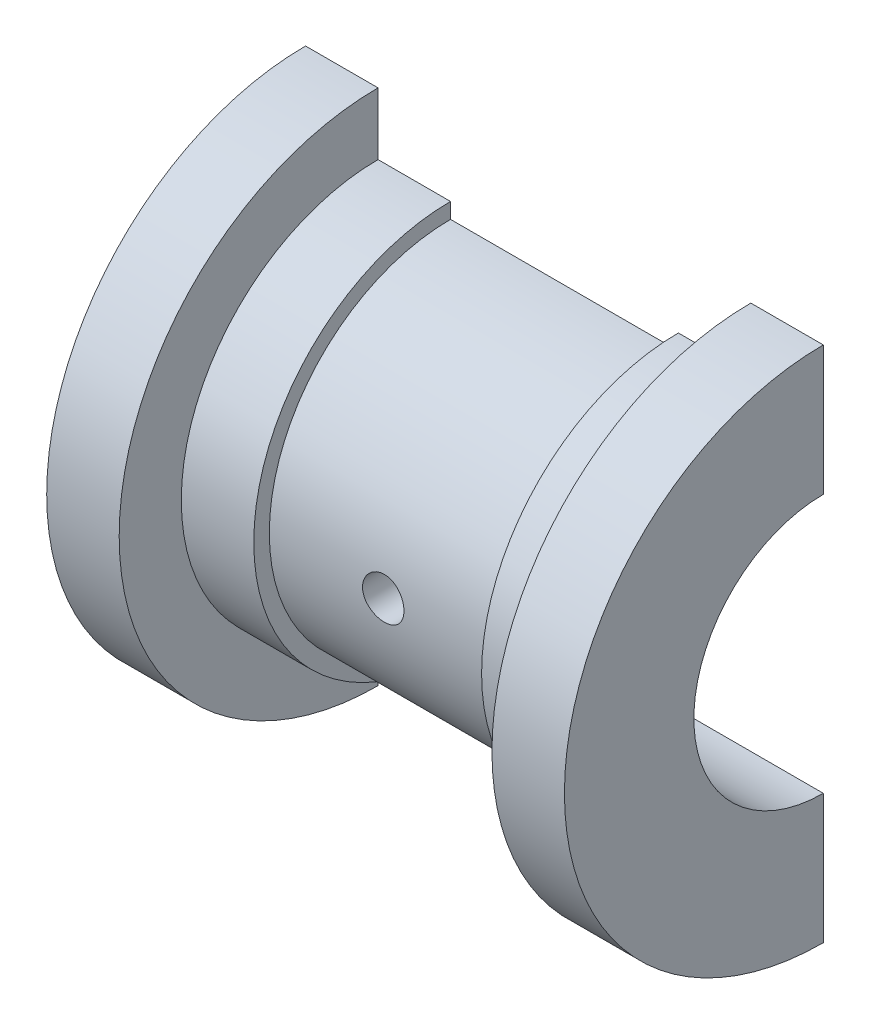
ISO-10303-21;
HEADER;
FILE_DESCRIPTION(('STEP AP214'),'2;1');
FILE_NAME('part.step','',(''),(''),'','','');
FILE_SCHEMA(('AUTOMOTIVE_DESIGN { 1 0 10303 214 1 1 1 1 }'));
ENDSEC;
DATA;
#1=APPLICATION_CONTEXT('core data for automotive mechanical design processes');
#2=APPLICATION_PROTOCOL_DEFINITION('international standard','automotive_design',2000,#1);
#3=PRODUCT_CONTEXT('',#1,'mechanical');
#4=PRODUCT('Part','Part','',(#3));
#5=PRODUCT_RELATED_PRODUCT_CATEGORY('part','',(#4));
#6=PRODUCT_DEFINITION_FORMATION('','',#4);
#7=PRODUCT_DEFINITION_CONTEXT('part definition',#1,'design');
#8=PRODUCT_DEFINITION('design','',#6,#7);
#9=PRODUCT_DEFINITION_SHAPE('','',#8);
#10=(LENGTH_UNIT() NAMED_UNIT(*) SI_UNIT(.MILLI.,.METRE.));
#11=(NAMED_UNIT(*) PLANE_ANGLE_UNIT() SI_UNIT($,.RADIAN.));
#12=(NAMED_UNIT(*) SI_UNIT($,.STERADIAN.) SOLID_ANGLE_UNIT());
#13=UNCERTAINTY_MEASURE_WITH_UNIT(LENGTH_MEASURE(1.E-05),#10,'distance_accuracy_value','');
#14=(GEOMETRIC_REPRESENTATION_CONTEXT(3) GLOBAL_UNCERTAINTY_ASSIGNED_CONTEXT((#13)) GLOBAL_UNIT_ASSIGNED_CONTEXT((#10,
#11,#12)) REPRESENTATION_CONTEXT('',''));
#15=CARTESIAN_POINT('',(0.,0.,0.));
#16=DIRECTION('',(0.,0.,1.));
#17=DIRECTION('',(1.,0.,0.));
#18=AXIS2_PLACEMENT_3D('',#15,#16,#17);
#19=CARTESIAN_POINT('',(-38.9493607052265,0.,0.));
#20=DIRECTION('',(-1.,0.,0.));
#21=DIRECTION('',(0.,-1.,0.));
#22=AXIS2_PLACEMENT_3D('',#19,#20,#21);
#23=CYLINDRICAL_SURFACE('',#22,17.5);
#24=CARTESIAN_POINT('',(11.,0.,0.));
#25=DIRECTION('',(-1.,0.,0.));
#26=DIRECTION('',(0.,-1.,0.));
#27=AXIS2_PLACEMENT_3D('',#24,#25,#26);
#28=CIRCLE('',#27,17.5);
#29=CARTESIAN_POINT('',(11.,-17.5,-1.2220184685951E-13));
#30=VERTEX_POINT('',#29);
#31=CARTESIAN_POINT('',(11.,17.5,0.));
#32=VERTEX_POINT('',#31);
#33=EDGE_CURVE('E192',#30,#32,#28,.T.);
#34=ORIENTED_EDGE('',*,*,#33,.T.);
#35=DIRECTION('',(-1.,0.,0.));
#36=VECTOR('',#35,1.);
#37=CARTESIAN_POINT('',(-11.,17.5,0.));
#38=LINE('',#37,#36);
#39=CARTESIAN_POINT('',(-11.,17.5,0.));
#40=VERTEX_POINT('',#39);
#41=EDGE_CURVE('E218',#32,#40,#38,.T.);
#42=ORIENTED_EDGE('',*,*,#41,.T.);
#43=CARTESIAN_POINT('',(-11.,0.,0.));
#44=DIRECTION('',(-1.,0.,0.));
#45=DIRECTION('',(0.,-1.,0.));
#46=AXIS2_PLACEMENT_3D('',#43,#44,#45);
#47=CIRCLE('',#46,17.5);
#48=CARTESIAN_POINT('',(-11.,-17.5,-1.2220184685951E-13));
#49=VERTEX_POINT('',#48);
#50=EDGE_CURVE('E194',#49,#40,#47,.T.);
#51=ORIENTED_EDGE('',*,*,#50,.F.);
#52=DIRECTION('',(-1.,0.,0.));
#53=VECTOR('',#52,1.);
#54=CARTESIAN_POINT('',(-11.,-17.5,-1.2220184685951E-13));
#55=LINE('',#54,#53);
#56=EDGE_CURVE('E170',#30,#49,#55,.T.);
#57=ORIENTED_EDGE('',*,*,#56,.F.);
#58=EDGE_LOOP('',(#34,#42,#51,#57));
#59=FACE_BOUND('',#58,.T.);
#60=CARTESIAN_POINT('',(0.,-2.00000000000012,17.3853386507137));
#61=CARTESIAN_POINT('',(0.111946589372524,-1.99999519733607,17.3853401353315));
#62=CARTESIAN_POINT('',(0.223964994921923,-1.99056928251654,17.3864315751054));
#63=CARTESIAN_POINT('',(0.444889671697474,-1.95311344773108,17.3906782331753));
#64=CARTESIAN_POINT('',(0.553792479503965,-1.92506360351956,17.3938356616542));
#65=CARTESIAN_POINT('',(0.765255030279527,-1.85119296589638,17.4018520931882));
#66=CARTESIAN_POINT('',(0.867818819285595,-1.80538364660721,17.4067099973959));
#67=CARTESIAN_POINT('',(1.06378206604588,-1.69731788496022,17.4175786814491));
#68=CARTESIAN_POINT('',(1.15718320126785,-1.63506446086883,17.423589249671));
#69=CARTESIAN_POINT('',(1.33262956371172,-1.49556368835398,17.4361176819346));
#70=CARTESIAN_POINT('',(1.41462552791579,-1.41825455823821,17.4426375676046));
#71=CARTESIAN_POINT('',(1.56450902249383,-1.2509695482429,17.4554317583341));
#72=CARTESIAN_POINT('',(1.63239587710581,-1.16099306200083,17.4617060516192));
#73=CARTESIAN_POINT('',(1.75230824059131,-0.970620910263756,17.4733225280882));
#74=CARTESIAN_POINT('',(1.80428955803743,-0.870197236204839,17.4786620969871));
#75=CARTESIAN_POINT('',(1.89063240605875,-0.661974973210041,17.4877853680334));
#76=CARTESIAN_POINT('',(1.9249944880326,-0.554176615186537,17.4915691188697));
#77=CARTESIAN_POINT('',(1.97497734252851,-0.334766558288145,17.4971402074225));
#78=CARTESIAN_POINT('',(1.99067964857446,-0.22317365719472,17.4989362281041));
#79=CARTESIAN_POINT('',(2.00314972142082,0.00107691382543691,17.5003590938998));
#80=CARTESIAN_POINT('',(1.99991811760643,0.113734548234908,17.4999860111176));
#81=CARTESIAN_POINT('',(1.9746778272773,0.336362487849558,17.497119767547));
#82=CARTESIAN_POINT('',(1.95275682041612,0.446342879003147,17.4946365066491));
#83=CARTESIAN_POINT('',(1.89089682950376,0.661053445479663,17.487840154992));
#84=CARTESIAN_POINT('',(1.85095755129325,0.765783535057179,17.4835270343592));
#85=CARTESIAN_POINT('',(1.75410019097594,0.967294288035632,17.4735386514763));
#86=CARTESIAN_POINT('',(1.69714377600709,1.06405636819033,17.4678603196472));
#87=CARTESIAN_POINT('',(1.56789678444337,1.2466816391767,17.4557776619181));
#88=CARTESIAN_POINT('',(1.49560561983236,1.33254441186891,17.449373308183));
#89=CARTESIAN_POINT('',(1.33724919448781,1.49144815236592,17.436513040988));
#90=CARTESIAN_POINT('',(1.25110758210007,1.56441304576833,17.4300570420279));
#91=CARTESIAN_POINT('',(1.0677588923309,1.69485961446726,17.4178574111694));
#92=CARTESIAN_POINT('',(0.970551789715113,1.7523412544539,17.4121137808956));
#93=CARTESIAN_POINT('',(0.767767939743451,1.85019181534937,17.4019890438088));
#94=CARTESIAN_POINT('',(0.662188535919723,1.89055527879392,17.3976083716403));
#95=CARTESIAN_POINT('',(0.445689423466888,1.95295957446176,17.3907142897617));
#96=CARTESIAN_POINT('',(0.334769928945009,1.97500114064263,17.3882008052542));
#97=CARTESIAN_POINT('',(0.111409276007052,2.00003653434772,17.3853390699854));
#98=CARTESIAN_POINT('',(-0.00101976549901365,2.00313713351242,17.384978682311));
#99=CARTESIAN_POINT('',(-0.224795725911944,1.99048370024856,17.3864318824203));
#100=CARTESIAN_POINT('',(-0.336142663982754,1.97473000234344,17.3882454316329));
#101=CARTESIAN_POINT('',(-0.554277710431836,1.92490480743112,17.3938311078367));
#102=CARTESIAN_POINT('',(-0.661077653557209,1.89088445720899,17.3975977651037));
#103=CARTESIAN_POINT('',(-0.867456208856069,1.80554412069028,17.4066608217964));
#104=CARTESIAN_POINT('',(-0.96703460698983,1.75422362188817,17.4119572665405));
#105=CARTESIAN_POINT('',(-1.15662812006314,1.63547501760183,17.4235123453982));
#106=CARTESIAN_POINT('',(-1.24659891285623,1.56797655870478,17.4297751382952));
#107=CARTESIAN_POINT('',(-1.41397230825862,1.41888814821172,17.442543959092));
#108=CARTESIAN_POINT('',(-1.49137450327603,1.33729773979944,17.4490499948718));
#109=CARTESIAN_POINT('',(-1.63178548317454,1.16187651855529,17.4616092377758));
#110=CARTESIAN_POINT('',(-1.69472433770165,1.0679895447053,17.4676601534551));
#111=CARTESIAN_POINT('',(-1.80393937919364,0.870915351390238,17.4785935486018));
#112=CARTESIAN_POINT('',(-1.8502158540187,0.767728292632447,17.4834760482544));
#113=CARTESIAN_POINT('',(-1.92467566123987,0.555220730050587,17.4915122431867));
#114=CARTESIAN_POINT('',(-1.95290023506191,0.445914831710572,17.4946698766728));
#115=CARTESIAN_POINT('',(-1.99058941951927,0.224077216219246,17.498916830849));
#116=CARTESIAN_POINT('',(-2.00005473054384,0.111545619660616,17.5000062287579));
#117=CARTESIAN_POINT('',(-1.99994510250234,-0.112864401253256,17.4999937520126));
#118=CARTESIAN_POINT('',(-1.99047832045056,-0.224742894695173,17.4989043247502));
#119=CARTESIAN_POINT('',(-1.95300127134245,-0.445308378800977,17.4946812487719));
#120=CARTESIAN_POINT('',(-1.92499100344009,-0.553995369319257,17.4915475999627));
#121=CARTESIAN_POINT('',(-1.85125428527817,-0.765084431079367,17.4835868311737));
#122=CARTESIAN_POINT('',(-1.80553211653411,-0.867488014290848,17.478760120486));
#123=CARTESIAN_POINT('',(-1.69768073352085,-1.06318537269573,17.4679493137143));
#124=CARTESIAN_POINT('',(-1.63555145524283,-1.15647911234707,17.4619652131149));
#125=CARTESIAN_POINT('',(-1.49624648821104,-1.33186210611065,17.4494678477128));
#126=CARTESIAN_POINT('',(-1.41899021819487,-1.41388716420701,17.4429518630307));
#127=CARTESIAN_POINT('',(-1.25178901681435,-1.56385330094132,17.4301475365176));
#128=CARTESIAN_POINT('',(-1.16184106815131,-1.63179102096634,17.4238592492668));
#129=CARTESIAN_POINT('',(-0.971480376349263,-1.75183717616211,17.4122005213082));
#130=CARTESIAN_POINT('',(-0.871034600637649,-1.80389349456606,17.4068331273112));
#131=CARTESIAN_POINT('',(-0.662825662631923,-1.89032803888989,17.3976597913728));
#132=CARTESIAN_POINT('',(-0.555070743865214,-1.92472581745891,17.3938521233529));
#133=CARTESIAN_POINT('',(-0.372277873121076,-1.96647476380533,17.3891702575432));
#134=CARTESIAN_POINT('',(-0.298400454831266,-1.97902906202822,17.3877403947785));
#135=CARTESIAN_POINT('',(-0.149692726088288,-1.99579326119787,17.3858240977585));
#136=CARTESIAN_POINT('',(-0.0748624212969904,-2.00000321170189,17.3853376579002));
#137=CARTESIAN_POINT('',(0.,-2.00000000000012,17.3853386507137));
#138=B_SPLINE_CURVE_WITH_KNOTS('',3,(#60,#61,#62,#63,#64,#65,#66,#67,#68,#69,#70,#71,#72,#73,
#74,#75,#76,#77,#78,#79,#80,#81,#82,#83,#84,#85,#86,#87,#88,#89,#90,#91,#92,#93,#94,#95,#96,#97,
#98,#99,#100,#101,#102,#103,#104,#105,#106,#107,#108,#109,#110,#111,#112,#113,#114,#115,#116,
#117,#118,#119,#120,#121,#122,#123,#124,#125,#126,#127,#128,#129,#130,#131,#132,#133,#134,#135,
#136,#137),.UNSPECIFIED.,.T.,.F.,(4,2,2,2,2,2,2,2,2,2,2,2,2,2,2,2,2,2,2,2,2,2,2,2,2,2,2,2,2,2,2,
2,2,2,2,2,2,2,4),(0.,0.335566330669862,0.671492236482426,1.00720146648589,1.34284912082551,
1.67990430025881,2.01697561937899,2.35497511648652,2.69296403516427,3.02947062308711,
3.36596602520247,3.70089142156129,4.03582228598058,4.3715133792636,4.70721734706225,
5.04483970261994,5.3824628281258,5.72019351085555,6.05791066376697,6.39372230997641,
6.72952799811684,7.06439829362762,7.3992785103225,7.73564232927687,8.07201705412561,
8.40998545131677,8.74794800946722,9.08513567305446,9.42231074728433,9.75756507912587,
10.0928194262631,10.4279927825518,10.7631674464669,11.1001786972192,11.4372702038874,
11.7754563049136,12.113267132881,12.3376728727777,12.5620772799195),.UNSPECIFIED.);
#139=CARTESIAN_POINT('',(0.,-2.00000000000012,17.3853386507137));
#140=VERTEX_POINT('',#139);
#141=EDGE_CURVE('E232',#140,#140,#138,.T.);
#142=ORIENTED_EDGE('',*,*,#141,.F.);
#143=EDGE_LOOP('',(#142));
#144=FACE_BOUND('',#143,.T.);
#145=ADVANCED_FACE('F37',(#59,#144),#23,.T.);
#146=CARTESIAN_POINT('',(25.,0.,0.));
#147=DIRECTION('',(-1.,0.,0.));
#148=DIRECTION('',(0.,-1.,0.));
#149=AXIS2_PLACEMENT_3D('',#146,#147,#148);
#150=CYLINDRICAL_SURFACE('',#149,12.5);
#151=CARTESIAN_POINT('',(-25.,0.,0.));
#152=DIRECTION('',(-1.,0.,0.));
#153=DIRECTION('',(0.,-1.,0.));
#154=AXIS2_PLACEMENT_3D('',#151,#152,#153);
#155=CIRCLE('',#154,12.5);
#156=CARTESIAN_POINT('',(-25.,-12.5,-1.74574066942157E-13));
#157=VERTEX_POINT('',#156);
#158=CARTESIAN_POINT('',(-25.,12.5,-1.74574066942157E-13));
#159=VERTEX_POINT('',#158);
#160=EDGE_CURVE('E134',#157,#159,#155,.T.);
#161=ORIENTED_EDGE('',*,*,#160,.T.);
#162=DIRECTION('',(-1.,0.,0.));
#163=VECTOR('',#162,1.);
#164=CARTESIAN_POINT('',(25.,12.5,-1.74574066942157E-13));
#165=LINE('',#164,#163);
#166=CARTESIAN_POINT('',(25.,12.5,-1.74574066942157E-13));
#167=VERTEX_POINT('',#166);
#168=EDGE_CURVE('E130',#167,#159,#165,.T.);
#169=ORIENTED_EDGE('',*,*,#168,.F.);
#170=CARTESIAN_POINT('',(25.,0.,0.));
#171=DIRECTION('',(-1.,0.,0.));
#172=DIRECTION('',(0.,-1.,0.));
#173=AXIS2_PLACEMENT_3D('',#170,#171,#172);
#174=CIRCLE('',#173,12.5);
#175=CARTESIAN_POINT('',(25.,-12.5,0.));
#176=VERTEX_POINT('',#175);
#177=EDGE_CURVE('E58',#176,#167,#174,.T.);
#178=ORIENTED_EDGE('',*,*,#177,.F.);
#179=DIRECTION('',(-1.,0.,0.));
#180=VECTOR('',#179,1.);
#181=CARTESIAN_POINT('',(25.,-12.5,-1.74574066942157E-13));
#182=LINE('',#181,#180);
#183=EDGE_CURVE('E138',#176,#157,#182,.T.);
#184=ORIENTED_EDGE('',*,*,#183,.T.);
#185=EDGE_LOOP('',(#161,#169,#178,#184));
#186=FACE_BOUND('',#185,.T.);
#187=CARTESIAN_POINT('',(0.,-2.00000000000009,12.3389626792531));
#188=CARTESIAN_POINT('',(-0.1115667153696,-1.99999546268278,12.3389646365747));
#189=CARTESIAN_POINT('',(-0.223195940876381,-1.9906330552036,12.3404922170901));
#190=CARTESIAN_POINT('',(-0.443326847344627,-1.95344445500893,12.3464325117521));
#191=CARTESIAN_POINT('',(-0.551825474504615,-1.92560083020003,12.3508479497636));
#192=CARTESIAN_POINT('',(-0.762477313101267,-1.85230972937135,12.3620513503607));
#193=CARTESIAN_POINT('',(-0.864635571645263,-1.80687646925898,12.3688373965941));
#194=CARTESIAN_POINT('',(-1.05986648038844,-1.69973041648439,12.3840151290006));
#195=CARTESIAN_POINT('',(-1.15294024493589,-1.63801962395051,12.3924066178675));
#196=CARTESIAN_POINT('',(-1.32821893279529,-1.49947140236488,12.409935008592));
#197=CARTESIAN_POINT('',(-1.41032926550982,-1.42251498707593,12.4190774196954));
#198=CARTESIAN_POINT('',(-1.56052945966013,-1.2559170981524,12.4370285016078));
#199=CARTESIAN_POINT('',(-1.62861851530075,-1.16627489597177,12.4458371532121));
#200=CARTESIAN_POINT('',(-1.7491959612917,-0.976239917029404,12.4621862608067));
#201=CARTESIAN_POINT('',(-1.80159669033811,-0.875790844473932,12.4697194921289));
#202=CARTESIAN_POINT('',(-1.88874693905998,-0.667375995891046,12.4826077762261));
#203=CARTESIAN_POINT('',(-1.92349751749068,-0.559410671172552,12.4879629596488));
#204=CARTESIAN_POINT('',(-1.97407274436243,-0.340004128946155,12.4958528816707));
#205=CARTESIAN_POINT('',(-1.99005611940511,-0.228600363359494,12.49841126176));
#206=CARTESIAN_POINT('',(-2.00313650808571,-0.00466480752233918,12.500500461766));
#207=CARTESIAN_POINT('',(-2.00023470914493,0.107866911362923,12.5000314720312));
#208=CARTESIAN_POINT('',(-1.97575151431498,0.329779715978444,12.4961375614702));
#209=CARTESIAN_POINT('',(-1.95434091575268,0.439180187321327,12.4927396690852));
#210=CARTESIAN_POINT('',(-1.89371648537535,0.652815342747586,12.4833998597574));
#211=CARTESIAN_POINT('',(-1.85450214519059,0.757049879228094,12.4774578701704));
#212=CARTESIAN_POINT('',(-1.75921154129989,0.957905986408951,12.4636513003451));
#213=CARTESIAN_POINT('',(-1.70306427260419,1.05449329349375,12.4557786507463));
#214=CARTESIAN_POINT('',(-1.57555357138301,1.23693967157024,12.4389865614945));
#215=CARTESIAN_POINT('',(-1.50418900182922,1.32279794013338,12.4300670436423));
#216=CARTESIAN_POINT('',(-1.34732043643976,1.48235721573527,12.4120565702159));
#217=CARTESIAN_POINT('',(-1.2616672241591,1.55591150821591,12.4029648129688));
#218=CARTESIAN_POINT('',(-1.07915724372807,1.68762680827432,12.3857313850728));
#219=CARTESIAN_POINT('',(-0.982300387310595,1.74578769456438,12.3775897219102));
#220=CARTESIAN_POINT('',(-0.779969490042987,1.84509031627284,12.3631781549851));
#221=CARTESIAN_POINT('',(-0.674487164843649,1.8862154542191,12.3569100782548));
#222=CARTESIAN_POINT('',(-0.457989378356675,1.95012354011936,12.3469864391895));
#223=CARTESIAN_POINT('',(-0.346974364635672,1.97290796919502,12.343330665898));
#224=CARTESIAN_POINT('',(-0.123872177326533,1.9992834999762,12.3390860491727));
#225=CARTESIAN_POINT('',(-0.0118102853156295,2.00308326374912,12.338463865144));
#226=CARTESIAN_POINT('',(0.211348966265646,1.99193667548237,12.3402681873056));
#227=CARTESIAN_POINT('',(0.322446359912494,1.97699098847038,12.3426945853422));
#228=CARTESIAN_POINT('',(0.539866905444395,1.92895527704852,12.350291946998));
#229=CARTESIAN_POINT('',(0.646213923180768,1.89597053344232,12.3554469800097));
#230=CARTESIAN_POINT('',(0.85187038701668,1.81290306911347,12.3679074973821));
#231=CARTESIAN_POINT('',(0.951179441681865,1.76281939828996,12.3752131012361));
#232=CARTESIAN_POINT('',(1.14087239308146,1.64647965217404,12.3912295180301));
#233=CARTESIAN_POINT('',(1.23117295357006,1.58008930093847,12.3999517832886));
#234=CARTESIAN_POINT('',(1.39942606063674,1.43320604247686,12.4177848415153));
#235=CARTESIAN_POINT('',(1.47737780864004,1.35271222391408,12.426895659562));
#236=CARTESIAN_POINT('',(1.61947729209286,1.17898475488113,12.4445842082074));
#237=CARTESIAN_POINT('',(1.68348622911078,1.08563688229291,12.4531560233311));
#238=CARTESIAN_POINT('',(1.7949130459885,0.88939184738847,12.4687070996719));
#239=CARTESIAN_POINT('',(1.8423314293228,0.786494974976238,12.4756864092145));
#240=CARTESIAN_POINT('',(1.91901272401869,0.574493777094251,12.4872402999743));
#241=CARTESIAN_POINT('',(1.94834960623599,0.465416763098491,12.4918246669271));
#242=CARTESIAN_POINT('',(1.98827383639251,0.243805255219738,12.4981133908354));
#243=CARTESIAN_POINT('',(1.99886260115402,0.131271023257642,12.4998179654206));
#244=CARTESIAN_POINT('',(2.00095179807928,-0.0927181607457992,12.5001523384762));
#245=CARTESIAN_POINT('',(1.99266389940292,-0.204171144783063,12.4988162330541));
#246=CARTESIAN_POINT('',(1.95769116172815,-0.42407633113731,12.4932886224694));
#247=CARTESIAN_POINT('',(1.93100640664942,-0.532528547140343,12.4890971303321));
#248=CARTESIAN_POINT('',(1.86007617517217,-0.743282123113034,12.4783277894448));
#249=CARTESIAN_POINT('',(1.81584732795194,-0.845589202324763,12.471752200968));
#250=CARTESIAN_POINT('',(1.71110753962108,-1.04136319830558,12.4569342995936));
#251=CARTESIAN_POINT('',(1.65059592553781,-1.13482974947663,12.4486919178104));
#252=CARTESIAN_POINT('',(1.51425167961562,-1.3113388914684,12.4313454639236));
#253=CARTESIAN_POINT('',(1.4382634970135,-1.39426053318845,12.4222331866072));
#254=CARTESIAN_POINT('',(1.27345013113633,-1.54625119082771,12.4042323453373));
#255=CARTESIAN_POINT('',(1.18462194427879,-1.61531695647607,12.3953438343009));
#256=CARTESIAN_POINT('',(0.995970826081012,-1.7380419173616,12.3787350502446));
#257=CARTESIAN_POINT('',(0.896080549743533,-1.79159866107398,12.3710226983478));
#258=CARTESIAN_POINT('',(0.688641710336668,-1.88109182389782,12.35773272045));
#259=CARTESIAN_POINT('',(0.581101048458822,-1.91704612842104,12.3521529288763));
#260=CARTESIAN_POINT('',(0.394262041879368,-1.96235985662772,12.3450187006154));
#261=CARTESIAN_POINT('',(0.316104706528516,-1.97645270113696,12.3427600761638));
#262=CARTESIAN_POINT('',(0.158642105439383,-1.99527431170461,12.339731381368));
#263=CARTESIAN_POINT('',(0.0793368579618939,-2.00000322655827,12.3389612873707));
#264=CARTESIAN_POINT('',(0.,-2.00000000000009,12.3389626792531));
#265=B_SPLINE_CURVE_WITH_KNOTS('',3,(#187,#188,#189,#190,#191,#192,#193,#194,#195,#196,#197,
#198,#199,#200,#201,#202,#203,#204,#205,#206,#207,#208,#209,#210,#211,#212,#213,#214,#215,#216,
#217,#218,#219,#220,#221,#222,#223,#224,#225,#226,#227,#228,#229,#230,#231,#232,#233,#234,#235,
#236,#237,#238,#239,#240,#241,#242,#243,#244,#245,#246,#247,#248,#249,#250,#251,#252,#253,#254,
#255,#256,#257,#258,#259,#260,#261,#262,#263,#264),.UNSPECIFIED.,.T.,.F.,(4,2,2,2,2,2,2,2,2,2,2,
2,2,2,2,2,2,2,2,2,2,2,2,2,2,2,2,2,2,2,2,2,2,2,2,2,2,2,4),(0.,0.334410082462096,0.66913604063283,
1.00359203680449,1.33800695527949,1.6751426933581,2.01229780104021,2.35130309503299,
2.69028805118043,3.02638485112864,3.36246051891023,3.69546762348862,4.0284842373816,
4.36291718178071,4.69737512358616,5.03557384337791,5.37377522782556,5.71230534220323,
6.05080811551122,6.3855820633356,6.72034413480418,7.05317297710997,7.38602031604106,
7.7217061792982,8.05741374188327,8.39632425403564,8.73522448035856,9.07272891067331,
9.41020783420237,9.74392117047707,10.0776329844848,10.4110292424998,10.7444392820194,
11.0813822106389,11.4184040861632,11.7576040091322,12.0964585602663,12.3342666441618,
12.5720709491951),.UNSPECIFIED.);
#266=CARTESIAN_POINT('',(0.,-2.00000000000009,12.3389626792531));
#267=VERTEX_POINT('',#266);
#268=EDGE_CURVE('E41',#267,#267,#265,.T.);
#269=ORIENTED_EDGE('',*,*,#268,.F.);
#270=EDGE_LOOP('',(#269));
#271=FACE_BOUND('',#270,.T.);
#272=ADVANCED_FACE('F131',(#186,#271),#150,.F.);
#273=CARTESIAN_POINT('',(0.,0.,0.));
#274=DIRECTION('',(0.,0.,1.));
#275=DIRECTION('',(-1.,0.,0.));
#276=AXIS2_PLACEMENT_3D('',#273,#274,#275);
#277=PLANE('',#276);
#278=DIRECTION('',(0.,-1.,0.));
#279=VECTOR('',#278,1.);
#280=CARTESIAN_POINT('',(25.,0.,0.));
#281=LINE('',#280,#279);
#282=CARTESIAN_POINT('',(25.,25.,0.));
#283=VERTEX_POINT('',#282);
#284=EDGE_CURVE('E144',#283,#167,#281,.T.);
#285=ORIENTED_EDGE('',*,*,#284,.T.);
#286=ORIENTED_EDGE('',*,*,#168,.T.);
#287=DIRECTION('',(0.,1.,0.));
#288=VECTOR('',#287,1.);
#289=CARTESIAN_POINT('',(-25.,0.,0.));
#290=LINE('',#289,#288);
#291=CARTESIAN_POINT('',(-25.,25.,0.));
#292=VERTEX_POINT('',#291);
#293=EDGE_CURVE('E212',#159,#292,#290,.T.);
#294=ORIENTED_EDGE('',*,*,#293,.T.);
#295=DIRECTION('',(-1.,0.,0.));
#296=VECTOR('',#295,1.);
#297=CARTESIAN_POINT('',(-25.,25.,0.));
#298=LINE('',#297,#296);
#299=CARTESIAN_POINT('',(-18.,25.,0.));
#300=VERTEX_POINT('',#299);
#301=EDGE_CURVE('E202',#300,#292,#298,.T.);
#302=ORIENTED_EDGE('',*,*,#301,.F.);
#303=DIRECTION('',(0.,1.,0.));
#304=VECTOR('',#303,1.);
#305=CARTESIAN_POINT('',(-18.,25.,0.));
#306=LINE('',#305,#304);
#307=CARTESIAN_POINT('',(-18.,19.,0.));
#308=VERTEX_POINT('',#307);
#309=EDGE_CURVE('E206',#308,#300,#306,.T.);
#310=ORIENTED_EDGE('',*,*,#309,.F.);
#311=DIRECTION('',(-1.,0.,0.));
#312=VECTOR('',#311,1.);
#313=CARTESIAN_POINT('',(-18.,19.,0.));
#314=LINE('',#313,#312);
#315=CARTESIAN_POINT('',(-11.,19.,0.));
#316=VERTEX_POINT('',#315);
#317=EDGE_CURVE('E210',#316,#308,#314,.T.);
#318=ORIENTED_EDGE('',*,*,#317,.F.);
#319=DIRECTION('',(0.,1.,0.));
#320=VECTOR('',#319,1.);
#321=CARTESIAN_POINT('',(-11.,19.,0.));
#322=LINE('',#321,#320);
#323=EDGE_CURVE('E215',#40,#316,#322,.T.);
#324=ORIENTED_EDGE('',*,*,#323,.F.);
#325=ORIENTED_EDGE('',*,*,#41,.F.);
#326=DIRECTION('',(0.,-1.,0.));
#327=VECTOR('',#326,1.);
#328=CARTESIAN_POINT('',(11.,19.,0.));
#329=LINE('',#328,#327);
#330=CARTESIAN_POINT('',(11.,19.,0.));
#331=VERTEX_POINT('',#330);
#332=EDGE_CURVE('E221',#331,#32,#329,.T.);
#333=ORIENTED_EDGE('',*,*,#332,.F.);
#334=DIRECTION('',(-1.,0.,0.));
#335=VECTOR('',#334,1.);
#336=CARTESIAN_POINT('',(18.,19.,0.));
#337=LINE('',#336,#335);
#338=CARTESIAN_POINT('',(18.,19.,0.));
#339=VERTEX_POINT('',#338);
#340=EDGE_CURVE('E224',#339,#331,#337,.T.);
#341=ORIENTED_EDGE('',*,*,#340,.F.);
#342=DIRECTION('',(0.,-1.,0.));
#343=VECTOR('',#342,1.);
#344=CARTESIAN_POINT('',(18.,25.,0.));
#345=LINE('',#344,#343);
#346=CARTESIAN_POINT('',(18.,25.,0.));
#347=VERTEX_POINT('',#346);
#348=EDGE_CURVE('E227',#347,#339,#345,.T.);
#349=ORIENTED_EDGE('',*,*,#348,.F.);
#350=DIRECTION('',(-1.,0.,0.));
#351=VECTOR('',#350,1.);
#352=CARTESIAN_POINT('',(25.,25.,0.));
#353=LINE('',#352,#351);
#354=EDGE_CURVE('E152',#283,#347,#353,.T.);
#355=ORIENTED_EDGE('',*,*,#354,.F.);
#356=EDGE_LOOP('',(#285,#286,#294,#302,#310,#318,#324,#325,#333,#341,#349,#355));
#357=FACE_BOUND('',#356,.T.);
#358=ADVANCED_FACE('F149',(#357),#277,.F.);
#359=CARTESIAN_POINT('',(-25.,0.,0.));
#360=DIRECTION('',(1.,0.,0.));
#361=DIRECTION('',(0.,1.,0.));
#362=AXIS2_PLACEMENT_3D('',#359,#360,#361);
#363=PLANE('',#362);
#364=ORIENTED_EDGE('',*,*,#293,.F.);
#365=ORIENTED_EDGE('',*,*,#160,.F.);
#366=CARTESIAN_POINT('',(-25.,-25.,-1.74574066942157E-13));
#367=VERTEX_POINT('',#366);
#368=EDGE_CURVE('E158',#367,#157,#290,.T.);
#369=ORIENTED_EDGE('',*,*,#368,.F.);
#370=CARTESIAN_POINT('',(-25.,0.,0.));
#371=DIRECTION('',(-1.,0.,0.));
#372=DIRECTION('',(0.,-1.,0.));
#373=AXIS2_PLACEMENT_3D('',#370,#371,#372);
#374=CIRCLE('',#373,25.);
#375=EDGE_CURVE('E11',#367,#292,#374,.T.);
#376=ORIENTED_EDGE('',*,*,#375,.T.);
#377=EDGE_LOOP('',(#364,#365,#369,#376));
#378=FACE_BOUND('',#377,.T.);
#379=ADVANCED_FACE('F254',(#378),#363,.F.);
#380=CARTESIAN_POINT('',(-38.9493607052265,0.,0.));
#381=DIRECTION('',(-1.,0.,0.));
#382=DIRECTION('',(0.,-1.,0.));
#383=AXIS2_PLACEMENT_3D('',#380,#381,#382);
#384=CYLINDRICAL_SURFACE('',#383,25.);
#385=CARTESIAN_POINT('',(-18.,0.,0.));
#386=DIRECTION('',(-1.,0.,0.));
#387=DIRECTION('',(0.,-1.,0.));
#388=AXIS2_PLACEMENT_3D('',#385,#386,#387);
#389=CIRCLE('',#388,25.);
#390=CARTESIAN_POINT('',(-18.,-25.,-1.74574066942157E-13));
#391=VERTEX_POINT('',#390);
#392=EDGE_CURVE('E51',#391,#300,#389,.T.);
#393=ORIENTED_EDGE('',*,*,#392,.T.);
#394=ORIENTED_EDGE('',*,*,#301,.T.);
#395=ORIENTED_EDGE('',*,*,#375,.F.);
#396=DIRECTION('',(-1.,0.,0.));
#397=VECTOR('',#396,1.);
#398=CARTESIAN_POINT('',(-25.,-25.,-1.74574066942157E-13));
#399=LINE('',#398,#397);
#400=EDGE_CURVE('E182',#391,#367,#399,.T.);
#401=ORIENTED_EDGE('',*,*,#400,.F.);
#402=EDGE_LOOP('',(#393,#394,#395,#401));
#403=FACE_BOUND('',#402,.T.);
#404=ADVANCED_FACE('F39',(#403),#384,.T.);
#405=CARTESIAN_POINT('',(-18.,-25.,-1.74574066942157E-13));
#406=DIRECTION('',(-1.,0.,0.));
#407=DIRECTION('',(0.,-1.,0.));
#408=AXIS2_PLACEMENT_3D('',#405,#406,#407);
#409=PLANE('',#408);
#410=CARTESIAN_POINT('',(-18.,0.,0.));
#411=DIRECTION('',(-1.,0.,0.));
#412=DIRECTION('',(0.,-1.,0.));
#413=AXIS2_PLACEMENT_3D('',#410,#411,#412);
#414=CIRCLE('',#413,19.);
#415=CARTESIAN_POINT('',(-18.,-19.,-1.32676290876039E-13));
#416=VERTEX_POINT('',#415);
#417=EDGE_CURVE('E198',#416,#308,#414,.T.);
#418=ORIENTED_EDGE('',*,*,#417,.T.);
#419=ORIENTED_EDGE('',*,*,#309,.T.);
#420=ORIENTED_EDGE('',*,*,#392,.F.);
#421=DIRECTION('',(0.,-1.,0.));
#422=VECTOR('',#421,1.);
#423=CARTESIAN_POINT('',(-18.,-25.,-1.74574066942157E-13));
#424=LINE('',#423,#422);
#425=EDGE_CURVE('E179',#416,#391,#424,.T.);
#426=ORIENTED_EDGE('',*,*,#425,.F.);
#427=EDGE_LOOP('',(#418,#419,#420,#426));
#428=FACE_BOUND('',#427,.T.);
#429=ADVANCED_FACE('F207',(#428),#409,.F.);
#430=CARTESIAN_POINT('',(-38.9493607052265,0.,0.));
#431=DIRECTION('',(-1.,0.,0.));
#432=DIRECTION('',(0.,-1.,0.));
#433=AXIS2_PLACEMENT_3D('',#430,#431,#432);
#434=CYLINDRICAL_SURFACE('',#433,19.);
#435=CARTESIAN_POINT('',(-11.,0.,0.));
#436=DIRECTION('',(-1.,0.,0.));
#437=DIRECTION('',(0.,-1.,0.));
#438=AXIS2_PLACEMENT_3D('',#435,#436,#437);
#439=CIRCLE('',#438,19.);
#440=CARTESIAN_POINT('',(-11.,-19.,-1.32676290876039E-13));
#441=VERTEX_POINT('',#440);
#442=EDGE_CURVE('E196',#441,#316,#439,.T.);
#443=ORIENTED_EDGE('',*,*,#442,.T.);
#444=ORIENTED_EDGE('',*,*,#317,.T.);
#445=ORIENTED_EDGE('',*,*,#417,.F.);
#446=DIRECTION('',(-1.,0.,0.));
#447=VECTOR('',#446,1.);
#448=CARTESIAN_POINT('',(-18.,-19.,-1.32676290876039E-13));
#449=LINE('',#448,#447);
#450=EDGE_CURVE('E176',#441,#416,#449,.T.);
#451=ORIENTED_EDGE('',*,*,#450,.F.);
#452=EDGE_LOOP('',(#443,#444,#445,#451));
#453=FACE_BOUND('',#452,.T.);
#454=ADVANCED_FACE('F278',(#453),#434,.T.);
#455=CARTESIAN_POINT('',(-11.,-19.,-1.32676290876039E-13));
#456=DIRECTION('',(-1.,0.,0.));
#457=DIRECTION('',(0.,-1.,0.));
#458=AXIS2_PLACEMENT_3D('',#455,#456,#457);
#459=PLANE('',#458);
#460=ORIENTED_EDGE('',*,*,#50,.T.);
#461=ORIENTED_EDGE('',*,*,#323,.T.);
#462=ORIENTED_EDGE('',*,*,#442,.F.);
#463=DIRECTION('',(0.,-1.,0.));
#464=VECTOR('',#463,1.);
#465=CARTESIAN_POINT('',(-11.,-19.,-1.32676290876039E-13));
#466=LINE('',#465,#464);
#467=EDGE_CURVE('E173',#49,#441,#466,.T.);
#468=ORIENTED_EDGE('',*,*,#467,.F.);
#469=EDGE_LOOP('',(#460,#461,#462,#468));
#470=FACE_BOUND('',#469,.T.);
#471=ADVANCED_FACE('F273',(#470),#459,.F.);
#472=CARTESIAN_POINT('',(11.,-19.,-1.32676290876039E-13));
#473=DIRECTION('',(1.,0.,0.));
#474=DIRECTION('',(0.,1.,0.));
#475=AXIS2_PLACEMENT_3D('',#472,#473,#474);
#476=PLANE('',#475);
#477=CARTESIAN_POINT('',(11.,0.,0.));
#478=DIRECTION('',(-1.,0.,0.));
#479=DIRECTION('',(0.,-1.,0.));
#480=AXIS2_PLACEMENT_3D('',#477,#478,#479);
#481=CIRCLE('',#480,19.);
#482=CARTESIAN_POINT('',(11.,-19.,-1.32676290876039E-13));
#483=VERTEX_POINT('',#482);
#484=EDGE_CURVE('E190',#483,#331,#481,.T.);
#485=ORIENTED_EDGE('',*,*,#484,.T.);
#486=ORIENTED_EDGE('',*,*,#332,.T.);
#487=ORIENTED_EDGE('',*,*,#33,.F.);
#488=DIRECTION('',(0.,1.,0.));
#489=VECTOR('',#488,1.);
#490=CARTESIAN_POINT('',(11.,-19.,-1.32676290876039E-13));
#491=LINE('',#490,#489);
#492=EDGE_CURVE('E167',#483,#30,#491,.T.);
#493=ORIENTED_EDGE('',*,*,#492,.F.);
#494=EDGE_LOOP('',(#485,#486,#487,#493));
#495=FACE_BOUND('',#494,.T.);
#496=ADVANCED_FACE('F270',(#495),#476,.F.);
#497=CARTESIAN_POINT('',(-38.9493607052265,0.,0.));
#498=DIRECTION('',(-1.,0.,0.));
#499=DIRECTION('',(0.,-1.,0.));
#500=AXIS2_PLACEMENT_3D('',#497,#498,#499);
#501=CYLINDRICAL_SURFACE('',#500,19.);
#502=CARTESIAN_POINT('',(18.,0.,0.));
#503=DIRECTION('',(-1.,0.,0.));
#504=DIRECTION('',(0.,-1.,0.));
#505=AXIS2_PLACEMENT_3D('',#502,#503,#504);
#506=CIRCLE('',#505,19.);
#507=CARTESIAN_POINT('',(18.,-19.,-1.32676290876039E-13));
#508=VERTEX_POINT('',#507);
#509=EDGE_CURVE('E188',#508,#339,#506,.T.);
#510=ORIENTED_EDGE('',*,*,#509,.T.);
#511=ORIENTED_EDGE('',*,*,#340,.T.);
#512=ORIENTED_EDGE('',*,*,#484,.F.);
#513=DIRECTION('',(-1.,0.,0.));
#514=VECTOR('',#513,1.);
#515=CARTESIAN_POINT('',(18.,-19.,-1.32676290876039E-13));
#516=LINE('',#515,#514);
#517=EDGE_CURVE('E164',#508,#483,#516,.T.);
#518=ORIENTED_EDGE('',*,*,#517,.F.);
#519=EDGE_LOOP('',(#510,#511,#512,#518));
#520=FACE_BOUND('',#519,.T.);
#521=ADVANCED_FACE('F267',(#520),#501,.T.);
#522=CARTESIAN_POINT('',(18.,-25.,-1.74574066942157E-13));
#523=DIRECTION('',(1.,0.,0.));
#524=DIRECTION('',(0.,1.,0.));
#525=AXIS2_PLACEMENT_3D('',#522,#523,#524);
#526=PLANE('',#525);
#527=CARTESIAN_POINT('',(18.,0.,0.));
#528=DIRECTION('',(-1.,0.,0.));
#529=DIRECTION('',(0.,-1.,0.));
#530=AXIS2_PLACEMENT_3D('',#527,#528,#529);
#531=CIRCLE('',#530,25.);
#532=CARTESIAN_POINT('',(18.,-25.,-1.74574066942157E-13));
#533=VERTEX_POINT('',#532);
#534=EDGE_CURVE('E186',#533,#347,#531,.T.);
#535=ORIENTED_EDGE('',*,*,#534,.T.);
#536=ORIENTED_EDGE('',*,*,#348,.T.);
#537=ORIENTED_EDGE('',*,*,#509,.F.);
#538=DIRECTION('',(0.,1.,0.));
#539=VECTOR('',#538,1.);
#540=CARTESIAN_POINT('',(18.,-25.,-1.74574066942157E-13));
#541=LINE('',#540,#539);
#542=EDGE_CURVE('E156',#533,#508,#541,.T.);
#543=ORIENTED_EDGE('',*,*,#542,.F.);
#544=EDGE_LOOP('',(#535,#536,#537,#543));
#545=FACE_BOUND('',#544,.T.);
#546=ADVANCED_FACE('F263',(#545),#526,.F.);
#547=CARTESIAN_POINT('',(-38.9493607052265,0.,0.));
#548=DIRECTION('',(-1.,0.,0.));
#549=DIRECTION('',(0.,-1.,0.));
#550=AXIS2_PLACEMENT_3D('',#547,#548,#549);
#551=CYLINDRICAL_SURFACE('',#550,25.);
#552=CARTESIAN_POINT('',(25.,0.,0.));
#553=DIRECTION('',(-1.,0.,0.));
#554=DIRECTION('',(0.,-1.,0.));
#555=AXIS2_PLACEMENT_3D('',#552,#553,#554);
#556=CIRCLE('',#555,25.);
#557=CARTESIAN_POINT('',(25.,-25.,-1.74574066942157E-13));
#558=VERTEX_POINT('',#557);
#559=EDGE_CURVE('E184',#558,#283,#556,.T.);
#560=ORIENTED_EDGE('',*,*,#559,.T.);
#561=ORIENTED_EDGE('',*,*,#354,.T.);
#562=ORIENTED_EDGE('',*,*,#534,.F.);
#563=DIRECTION('',(-1.,0.,0.));
#564=VECTOR('',#563,1.);
#565=CARTESIAN_POINT('',(25.,-25.,-1.74574066942157E-13));
#566=LINE('',#565,#564);
#567=EDGE_CURVE('E153',#558,#533,#566,.T.);
#568=ORIENTED_EDGE('',*,*,#567,.F.);
#569=EDGE_LOOP('',(#560,#561,#562,#568));
#570=FACE_BOUND('',#569,.T.);
#571=ADVANCED_FACE('F260',(#570),#551,.T.);
#572=CARTESIAN_POINT('',(25.,0.,0.));
#573=DIRECTION('',(-1.,0.,0.));
#574=DIRECTION('',(0.,-1.,0.));
#575=AXIS2_PLACEMENT_3D('',#572,#573,#574);
#576=PLANE('',#575);
#577=EDGE_CURVE('E146',#176,#558,#281,.T.);
#578=ORIENTED_EDGE('',*,*,#577,.F.);
#579=ORIENTED_EDGE('',*,*,#177,.T.);
#580=ORIENTED_EDGE('',*,*,#284,.F.);
#581=ORIENTED_EDGE('',*,*,#559,.F.);
#582=EDGE_LOOP('',(#578,#579,#580,#581));
#583=FACE_BOUND('',#582,.T.);
#584=ADVANCED_FACE('F142',(#583),#576,.F.);
#585=ORIENTED_EDGE('',*,*,#368,.T.);
#586=ORIENTED_EDGE('',*,*,#183,.F.);
#587=ORIENTED_EDGE('',*,*,#577,.T.);
#588=ORIENTED_EDGE('',*,*,#567,.T.);
#589=ORIENTED_EDGE('',*,*,#542,.T.);
#590=ORIENTED_EDGE('',*,*,#517,.T.);
#591=ORIENTED_EDGE('',*,*,#492,.T.);
#592=ORIENTED_EDGE('',*,*,#56,.T.);
#593=ORIENTED_EDGE('',*,*,#467,.T.);
#594=ORIENTED_EDGE('',*,*,#450,.T.);
#595=ORIENTED_EDGE('',*,*,#425,.T.);
#596=ORIENTED_EDGE('',*,*,#400,.T.);
#597=EDGE_LOOP('',(#585,#586,#587,#588,#589,#590,#591,#592,#593,#594,#595,#596));
#598=FACE_BOUND('',#597,.T.);
#599=ADVANCED_FACE('F245',(#598),#277,.F.);
#600=CARTESIAN_POINT('',(0.,1.78065548281E-13,-25.5));
#601=DIRECTION('',(0.,0.,1.));
#602=DIRECTION('',(0.,-1.,0.));
#603=AXIS2_PLACEMENT_3D('',#600,#601,#602);
#604=CYLINDRICAL_SURFACE('',#603,2.);
#605=ORIENTED_EDGE('',*,*,#268,.T.);
#606=EDGE_LOOP('',(#605));
#607=FACE_BOUND('',#606,.T.);
#608=ORIENTED_EDGE('',*,*,#141,.T.);
#609=EDGE_LOOP('',(#608));
#610=FACE_BOUND('',#609,.T.);
#611=ADVANCED_FACE('F242',(#607,#610),#604,.F.);
#612=CLOSED_SHELL('',(#145,#272,#358,#379,#404,#429,#454,#471,#496,#521,#546,#571,#584,#599,#611));
#613=MANIFOLD_SOLID_BREP('B2',#612);
#614=ADVANCED_BREP_SHAPE_REPRESENTATION('',(#18,#613),#14);
#615=SHAPE_DEFINITION_REPRESENTATION(#9,#614);
ENDSEC;
END-ISO-10303-21;
